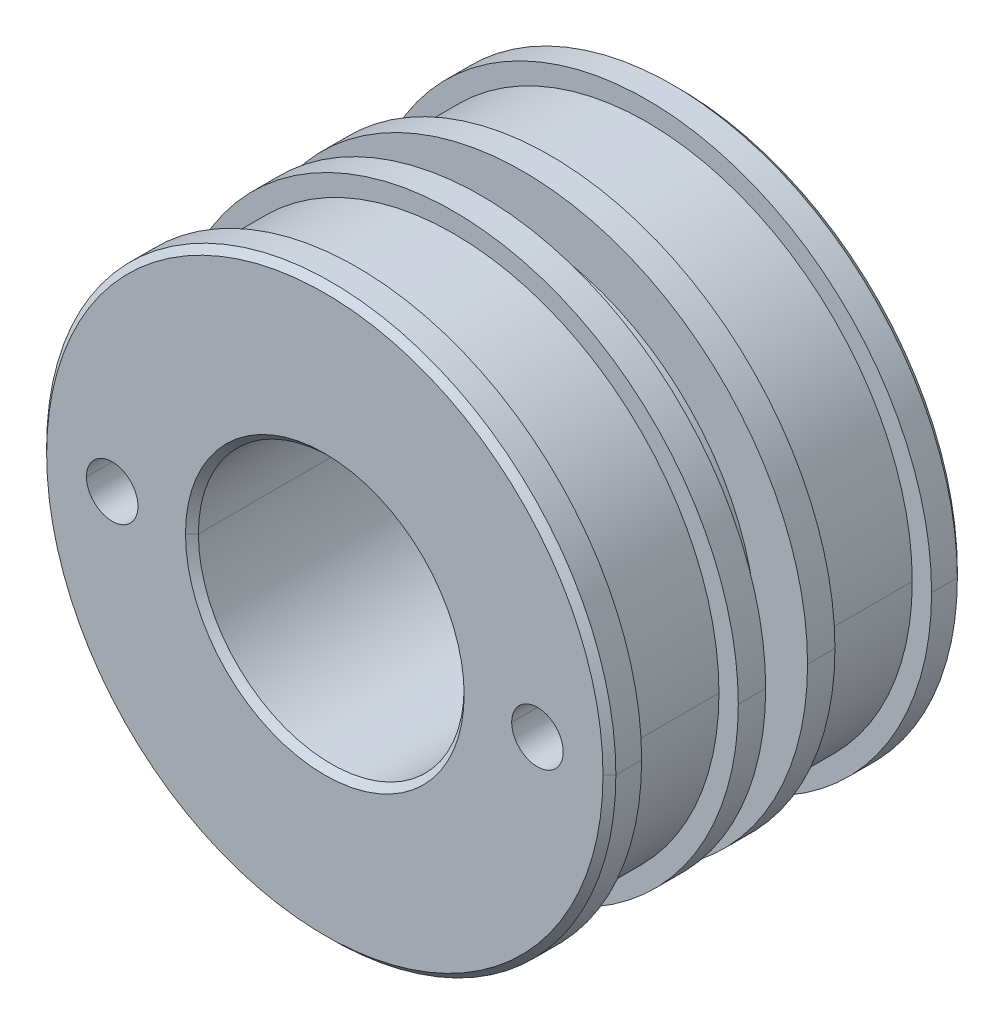
ISO-10303-21;
HEADER;
FILE_DESCRIPTION(('STEP AP214'),'2;1');
FILE_NAME('part.step','',(''),(''),'','','');
FILE_SCHEMA(('AUTOMOTIVE_DESIGN { 1 0 10303 214 1 1 1 1 }'));
ENDSEC;
DATA;
#1=APPLICATION_CONTEXT('core data for automotive mechanical design processes');
#2=APPLICATION_PROTOCOL_DEFINITION('international standard','automotive_design',2000,#1);
#3=PRODUCT_CONTEXT('',#1,'mechanical');
#4=PRODUCT('Part','Part','',(#3));
#5=PRODUCT_RELATED_PRODUCT_CATEGORY('part','',(#4));
#6=PRODUCT_DEFINITION_FORMATION('','',#4);
#7=PRODUCT_DEFINITION_CONTEXT('part definition',#1,'design');
#8=PRODUCT_DEFINITION('design','',#6,#7);
#9=PRODUCT_DEFINITION_SHAPE('','',#8);
#10=(LENGTH_UNIT() NAMED_UNIT(*) SI_UNIT(.MILLI.,.METRE.));
#11=(NAMED_UNIT(*) PLANE_ANGLE_UNIT() SI_UNIT($,.RADIAN.));
#12=(NAMED_UNIT(*) SI_UNIT($,.STERADIAN.) SOLID_ANGLE_UNIT());
#13=UNCERTAINTY_MEASURE_WITH_UNIT(LENGTH_MEASURE(1.E-05),#10,'distance_accuracy_value','');
#14=(GEOMETRIC_REPRESENTATION_CONTEXT(3) GLOBAL_UNCERTAINTY_ASSIGNED_CONTEXT((#13)) GLOBAL_UNIT_ASSIGNED_CONTEXT((#10,
#11,#12)) REPRESENTATION_CONTEXT('',''));
#15=CARTESIAN_POINT('',(0.,0.,0.));
#16=DIRECTION('',(0.,0.,1.));
#17=DIRECTION('',(1.,0.,0.));
#18=AXIS2_PLACEMENT_3D('',#15,#16,#17);
#19=CARTESIAN_POINT('',(-33.,0.,-9.));
#20=DIRECTION('',(0.,0.,1.));
#21=DIRECTION('',(1.,0.,0.));
#22=AXIS2_PLACEMENT_3D('',#19,#20,#21);
#23=PLANE('',#22);
#24=CARTESIAN_POINT('',(-33.,0.,-9.));
#25=DIRECTION('',(0.,0.,1.));
#26=DIRECTION('',(1.,0.,0.));
#27=AXIS2_PLACEMENT_3D('',#24,#25,#26);
#28=CIRCLE('',#27,4.);
#29=CARTESIAN_POINT('',(-29.,0.,-9.));
#30=VERTEX_POINT('',#29);
#31=CARTESIAN_POINT('',(-37.,0.,-9.));
#32=VERTEX_POINT('',#31);
#33=EDGE_CURVE('E10',#30,#32,#28,.T.);
#34=ORIENTED_EDGE('',*,*,#33,.T.);
#35=CARTESIAN_POINT('',(-33.,0.,-9.));
#36=DIRECTION('',(0.,0.,1.));
#37=DIRECTION('',(1.,0.,0.));
#38=AXIS2_PLACEMENT_3D('',#35,#36,#37);
#39=CIRCLE('',#38,4.);
#40=EDGE_CURVE('E388',#32,#30,#39,.T.);
#41=ORIENTED_EDGE('',*,*,#40,.T.);
#42=EDGE_LOOP('',(#34,#41));
#43=FACE_BOUND('',#42,.T.);
#44=ADVANCED_FACE('F15',(#43),#23,.T.);
#45=CARTESIAN_POINT('',(-33.,0.,-9.));
#46=DIRECTION('',(0.,0.,1.));
#47=DIRECTION('',(1.,0.,0.));
#48=AXIS2_PLACEMENT_3D('',#45,#46,#47);
#49=CYLINDRICAL_SURFACE('',#48,4.);
#50=DIRECTION('',(0.,0.,1.));
#51=VECTOR('',#50,1.);
#52=CARTESIAN_POINT('',(-37.,0.,-9.));
#53=LINE('',#52,#51);
#54=CARTESIAN_POINT('',(-37.,0.,0.));
#55=VERTEX_POINT('',#54);
#56=EDGE_CURVE('E384',#32,#55,#53,.T.);
#57=ORIENTED_EDGE('',*,*,#56,.F.);
#58=ORIENTED_EDGE('',*,*,#33,.F.);
#59=DIRECTION('',(0.,0.,1.));
#60=VECTOR('',#59,1.);
#61=CARTESIAN_POINT('',(-29.,0.,-9.));
#62=LINE('',#61,#60);
#63=CARTESIAN_POINT('',(-29.,0.,0.));
#64=VERTEX_POINT('',#63);
#65=EDGE_CURVE('E363',#30,#64,#62,.T.);
#66=ORIENTED_EDGE('',*,*,#65,.T.);
#67=CARTESIAN_POINT('',(-33.,0.,0.));
#68=DIRECTION('',(0.,0.,1.));
#69=DIRECTION('',(1.,0.,0.));
#70=AXIS2_PLACEMENT_3D('',#67,#68,#69);
#71=CIRCLE('',#70,4.);
#72=EDGE_CURVE('E334',#64,#55,#71,.T.);
#73=ORIENTED_EDGE('',*,*,#72,.T.);
#74=EDGE_LOOP('',(#57,#58,#66,#73));
#75=FACE_BOUND('',#74,.T.);
#76=ADVANCED_FACE('F575',(#75),#49,.F.);
#77=CARTESIAN_POINT('',(33.,0.,-9.));
#78=DIRECTION('',(0.,0.,1.));
#79=DIRECTION('',(1.,0.,0.));
#80=AXIS2_PLACEMENT_3D('',#77,#78,#79);
#81=PLANE('',#80);
#82=CARTESIAN_POINT('',(33.,0.,-9.));
#83=DIRECTION('',(0.,0.,1.));
#84=DIRECTION('',(1.,0.,0.));
#85=AXIS2_PLACEMENT_3D('',#82,#83,#84);
#86=CIRCLE('',#85,4.);
#87=CARTESIAN_POINT('',(37.,0.,-9.));
#88=VERTEX_POINT('',#87);
#89=CARTESIAN_POINT('',(29.,0.,-9.));
#90=VERTEX_POINT('',#89);
#91=EDGE_CURVE('E26',#88,#90,#86,.T.);
#92=ORIENTED_EDGE('',*,*,#91,.T.);
#93=CARTESIAN_POINT('',(33.,0.,-9.));
#94=DIRECTION('',(0.,0.,1.));
#95=DIRECTION('',(1.,0.,0.));
#96=AXIS2_PLACEMENT_3D('',#93,#94,#95);
#97=CIRCLE('',#96,4.);
#98=EDGE_CURVE('E367',#90,#88,#97,.T.);
#99=ORIENTED_EDGE('',*,*,#98,.T.);
#100=EDGE_LOOP('',(#92,#99));
#101=FACE_BOUND('',#100,.T.);
#102=ADVANCED_FACE('F581',(#101),#81,.T.);
#103=CARTESIAN_POINT('',(33.,0.,-9.));
#104=DIRECTION('',(0.,0.,1.));
#105=DIRECTION('',(1.,0.,0.));
#106=AXIS2_PLACEMENT_3D('',#103,#104,#105);
#107=CYLINDRICAL_SURFACE('',#106,4.);
#108=DIRECTION('',(0.,0.,1.));
#109=VECTOR('',#108,1.);
#110=CARTESIAN_POINT('',(29.,0.,-9.));
#111=LINE('',#110,#109);
#112=CARTESIAN_POINT('',(29.,0.,0.));
#113=VERTEX_POINT('',#112);
#114=EDGE_CURVE('E487',#90,#113,#111,.T.);
#115=ORIENTED_EDGE('',*,*,#114,.F.);
#116=ORIENTED_EDGE('',*,*,#91,.F.);
#117=DIRECTION('',(0.,0.,1.));
#118=VECTOR('',#117,1.);
#119=CARTESIAN_POINT('',(37.,0.,-9.));
#120=LINE('',#119,#118);
#121=CARTESIAN_POINT('',(37.,0.,0.));
#122=VERTEX_POINT('',#121);
#123=EDGE_CURVE('E279',#88,#122,#120,.T.);
#124=ORIENTED_EDGE('',*,*,#123,.T.);
#125=CARTESIAN_POINT('',(33.,0.,0.));
#126=DIRECTION('',(0.,0.,1.));
#127=DIRECTION('',(1.,0.,0.));
#128=AXIS2_PLACEMENT_3D('',#125,#126,#127);
#129=CIRCLE('',#128,4.);
#130=EDGE_CURVE('E331',#122,#113,#129,.T.);
#131=ORIENTED_EDGE('',*,*,#130,.T.);
#132=EDGE_LOOP('',(#115,#116,#124,#131));
#133=FACE_BOUND('',#132,.T.);
#134=ADVANCED_FACE('F604',(#133),#107,.F.);
#135=CARTESIAN_POINT('',(0.,0.,-54.));
#136=DIRECTION('',(0.,0.,-1.));
#137=DIRECTION('',(-1.,0.,0.));
#138=AXIS2_PLACEMENT_3D('',#135,#136,#137);
#139=CONICAL_SURFACE('',#138,24.5,0.785398163397452);
#140=DIRECTION('',(0.70710678118655,0.,-0.707106781186545));
#141=VECTOR('',#140,1.);
#142=CARTESIAN_POINT('',(24.5,0.,-54.));
#143=LINE('',#142,#141);
#144=CARTESIAN_POINT('',(24.5,0.,-54.));
#145=VERTEX_POINT('',#144);
#146=CARTESIAN_POINT('',(25.5,0.,-55.));
#147=VERTEX_POINT('',#146);
#148=EDGE_CURVE('E355',#145,#147,#143,.T.);
#149=ORIENTED_EDGE('',*,*,#148,.F.);
#150=CARTESIAN_POINT('',(0.,0.,-54.));
#151=DIRECTION('',(0.,0.,-1.));
#152=DIRECTION('',(1.,0.,0.));
#153=AXIS2_PLACEMENT_3D('',#150,#151,#152);
#154=CIRCLE('',#153,24.5);
#155=CARTESIAN_POINT('',(-24.5,0.,-54.));
#156=VERTEX_POINT('',#155);
#157=EDGE_CURVE('E278',#156,#145,#154,.T.);
#158=ORIENTED_EDGE('',*,*,#157,.F.);
#159=DIRECTION('',(-0.70710678118655,0.,-0.707106781186545));
#160=VECTOR('',#159,1.);
#161=CARTESIAN_POINT('',(-24.5,0.,-54.));
#162=LINE('',#161,#160);
#163=CARTESIAN_POINT('',(-25.5,0.,-55.));
#164=VERTEX_POINT('',#163);
#165=EDGE_CURVE('E372',#156,#164,#162,.T.);
#166=ORIENTED_EDGE('',*,*,#165,.T.);
#167=CARTESIAN_POINT('',(0.,0.,-55.));
#168=DIRECTION('',(0.,0.,1.));
#169=DIRECTION('',(1.,0.,0.));
#170=AXIS2_PLACEMENT_3D('',#167,#168,#169);
#171=CIRCLE('',#170,25.5);
#172=EDGE_CURVE('E321',#147,#164,#171,.T.);
#173=ORIENTED_EDGE('',*,*,#172,.F.);
#174=EDGE_LOOP('',(#149,#158,#166,#173));
#175=FACE_BOUND('',#174,.T.);
#176=ADVANCED_FACE('F822',(#175),#139,.F.);
#177=CARTESIAN_POINT('',(0.,0.,-40.));
#178=DIRECTION('',(0.,0.,-1.));
#179=DIRECTION('',(-1.,0.,0.));
#180=AXIS2_PLACEMENT_3D('',#177,#178,#179);
#181=CYLINDRICAL_SURFACE('',#180,24.5);
#182=DIRECTION('',(0.,0.,-1.));
#183=VECTOR('',#182,1.);
#184=CARTESIAN_POINT('',(24.5,0.,-40.));
#185=LINE('',#184,#183);
#186=CARTESIAN_POINT('',(24.5,0.,-40.));
#187=VERTEX_POINT('',#186);
#188=EDGE_CURVE('E396',#187,#145,#185,.T.);
#189=ORIENTED_EDGE('',*,*,#188,.F.);
#190=CARTESIAN_POINT('',(0.,0.,-40.));
#191=DIRECTION('',(0.,0.,-1.));
#192=DIRECTION('',(-1.,0.,0.));
#193=AXIS2_PLACEMENT_3D('',#190,#191,#192);
#194=CIRCLE('',#193,24.5);
#195=CARTESIAN_POINT('',(-24.5,0.,-40.));
#196=VERTEX_POINT('',#195);
#197=EDGE_CURVE('E275',#196,#187,#194,.T.);
#198=ORIENTED_EDGE('',*,*,#197,.F.);
#199=DIRECTION('',(0.,0.,-1.));
#200=VECTOR('',#199,1.);
#201=CARTESIAN_POINT('',(-24.5,0.,-40.));
#202=LINE('',#201,#200);
#203=EDGE_CURVE('E354',#196,#156,#202,.T.);
#204=ORIENTED_EDGE('',*,*,#203,.T.);
#205=ORIENTED_EDGE('',*,*,#157,.T.);
#206=EDGE_LOOP('',(#189,#198,#204,#205));
#207=FACE_BOUND('',#206,.T.);
#208=ADVANCED_FACE('F827',(#207),#181,.F.);
#209=CARTESIAN_POINT('',(0.,0.,-40.));
#210=DIRECTION('',(0.,0.,-1.));
#211=DIRECTION('',(0.,-1.,0.));
#212=AXIS2_PLACEMENT_3D('',#209,#210,#211);
#213=PLANE('',#212);
#214=CARTESIAN_POINT('',(0.,0.,-40.));
#215=DIRECTION('',(0.,0.,1.));
#216=DIRECTION('',(-1.,0.,0.));
#217=AXIS2_PLACEMENT_3D('',#214,#215,#216);
#218=CIRCLE('',#217,20.625);
#219=CARTESIAN_POINT('',(20.625,0.,-40.));
#220=VERTEX_POINT('',#219);
#221=CARTESIAN_POINT('',(-20.625,0.,-40.));
#222=VERTEX_POINT('',#221);
#223=EDGE_CURVE('E41',#220,#222,#218,.T.);
#224=ORIENTED_EDGE('',*,*,#223,.T.);
#225=CARTESIAN_POINT('',(0.,0.,-40.));
#226=DIRECTION('',(0.,0.,1.));
#227=DIRECTION('',(-1.,0.,0.));
#228=AXIS2_PLACEMENT_3D('',#225,#226,#227);
#229=CIRCLE('',#228,20.625);
#230=EDGE_CURVE('E320',#222,#220,#229,.T.);
#231=ORIENTED_EDGE('',*,*,#230,.T.);
#232=EDGE_LOOP('',(#224,#231));
#233=FACE_BOUND('',#232,.T.);
#234=ORIENTED_EDGE('',*,*,#197,.T.);
#235=CARTESIAN_POINT('',(0.,0.,-40.));
#236=DIRECTION('',(0.,0.,-1.));
#237=DIRECTION('',(-1.,0.,0.));
#238=AXIS2_PLACEMENT_3D('',#235,#236,#237);
#239=CIRCLE('',#238,24.5);
#240=EDGE_CURVE('E376',#187,#196,#239,.T.);
#241=ORIENTED_EDGE('',*,*,#240,.T.);
#242=EDGE_LOOP('',(#234,#241));
#243=FACE_BOUND('',#242,.T.);
#244=ADVANCED_FACE('F624',(#233,#243),#213,.T.);
#245=CARTESIAN_POINT('',(0.,0.,0.));
#246=DIRECTION('',(0.,0.,-1.));
#247=DIRECTION('',(-1.,0.,0.));
#248=AXIS2_PLACEMENT_3D('',#245,#246,#247);
#249=CONICAL_SURFACE('',#248,43.175,0.785398163397435);
#250=DIRECTION('',(0.707106781186538,0.,-0.707106781186558));
#251=VECTOR('',#250,1.);
#252=CARTESIAN_POINT('',(43.175,0.,0.));
#253=LINE('',#252,#251);
#254=CARTESIAN_POINT('',(43.175,0.,0.));
#255=VERTEX_POINT('',#254);
#256=CARTESIAN_POINT('',(44.175,0.,-1.00000000000004));
#257=VERTEX_POINT('',#256);
#258=EDGE_CURVE('E353',#255,#257,#253,.T.);
#259=ORIENTED_EDGE('',*,*,#258,.F.);
#260=CARTESIAN_POINT('',(0.,0.,0.));
#261=DIRECTION('',(0.,0.,1.));
#262=DIRECTION('',(1.,0.,0.));
#263=AXIS2_PLACEMENT_3D('',#260,#261,#262);
#264=CIRCLE('',#263,43.175);
#265=CARTESIAN_POINT('',(-43.175,0.,0.));
#266=VERTEX_POINT('',#265);
#267=EDGE_CURVE('E325',#266,#255,#264,.T.);
#268=ORIENTED_EDGE('',*,*,#267,.F.);
#269=DIRECTION('',(-0.707106781186538,0.,-0.707106781186558));
#270=VECTOR('',#269,1.);
#271=CARTESIAN_POINT('',(-43.175,0.,0.));
#272=LINE('',#271,#270);
#273=CARTESIAN_POINT('',(-44.175,0.,-1.00000000000004));
#274=VERTEX_POINT('',#273);
#275=EDGE_CURVE('E314',#266,#274,#272,.T.);
#276=ORIENTED_EDGE('',*,*,#275,.T.);
#277=CARTESIAN_POINT('',(0.,0.,-1.00000000000004));
#278=DIRECTION('',(0.,0.,-1.));
#279=DIRECTION('',(1.,0.,0.));
#280=AXIS2_PLACEMENT_3D('',#277,#278,#279);
#281=CIRCLE('',#280,44.175);
#282=EDGE_CURVE('E441',#257,#274,#281,.T.);
#283=ORIENTED_EDGE('',*,*,#282,.F.);
#284=EDGE_LOOP('',(#259,#268,#276,#283));
#285=FACE_BOUND('',#284,.T.);
#286=ADVANCED_FACE('F621',(#285),#249,.T.);
#287=CARTESIAN_POINT('',(0.,0.,-1.00000000000002));
#288=DIRECTION('',(0.,0.,1.));
#289=DIRECTION('',(1.,0.,0.));
#290=AXIS2_PLACEMENT_3D('',#287,#288,#289);
#291=CONICAL_SURFACE('',#290,20.625,0.785398163397453);
#292=DIRECTION('',(-0.707106781186551,0.,0.707106781186544));
#293=VECTOR('',#292,1.);
#294=CARTESIAN_POINT('',(-20.625,0.,-1.00000000000002));
#295=LINE('',#294,#293);
#296=CARTESIAN_POINT('',(-20.625,0.,-1.00000000000002));
#297=VERTEX_POINT('',#296);
#298=CARTESIAN_POINT('',(-21.625,0.,0.));
#299=VERTEX_POINT('',#298);
#300=EDGE_CURVE('E313',#297,#299,#295,.T.);
#301=ORIENTED_EDGE('',*,*,#300,.F.);
#302=CARTESIAN_POINT('',(0.,0.,-1.00000000000002));
#303=DIRECTION('',(0.,0.,1.));
#304=DIRECTION('',(1.,0.,0.));
#305=AXIS2_PLACEMENT_3D('',#302,#303,#304);
#306=CIRCLE('',#305,20.625);
#307=CARTESIAN_POINT('',(20.625,0.,-1.00000000000002));
#308=VERTEX_POINT('',#307);
#309=EDGE_CURVE('E175',#308,#297,#306,.T.);
#310=ORIENTED_EDGE('',*,*,#309,.F.);
#311=DIRECTION('',(0.707106781186551,0.,0.707106781186544));
#312=VECTOR('',#311,1.);
#313=CARTESIAN_POINT('',(20.625,0.,-1.00000000000002));
#314=LINE('',#313,#312);
#315=CARTESIAN_POINT('',(21.625,0.,0.));
#316=VERTEX_POINT('',#315);
#317=EDGE_CURVE('E435',#308,#316,#314,.T.);
#318=ORIENTED_EDGE('',*,*,#317,.T.);
#319=CARTESIAN_POINT('',(0.,0.,0.));
#320=DIRECTION('',(0.,0.,-1.));
#321=DIRECTION('',(1.,0.,0.));
#322=AXIS2_PLACEMENT_3D('',#319,#320,#321);
#323=CIRCLE('',#322,21.625);
#324=EDGE_CURVE('E184',#299,#316,#323,.T.);
#325=ORIENTED_EDGE('',*,*,#324,.F.);
#326=EDGE_LOOP('',(#301,#310,#318,#325));
#327=FACE_BOUND('',#326,.T.);
#328=ADVANCED_FACE('F600',(#327),#291,.F.);
#329=CARTESIAN_POINT('',(0.,0.,-54.));
#330=DIRECTION('',(0.,0.,1.));
#331=DIRECTION('',(1.,0.,0.));
#332=AXIS2_PLACEMENT_3D('',#329,#330,#331);
#333=CONICAL_SURFACE('',#332,44.175,0.785398163397459);
#334=DIRECTION('',(-0.707106781186555,0.,0.70710678118654));
#335=VECTOR('',#334,1.);
#336=CARTESIAN_POINT('',(-44.175,0.,-54.));
#337=LINE('',#336,#335);
#338=CARTESIAN_POINT('',(-43.175,0.,-55.));
#339=VERTEX_POINT('',#338);
#340=CARTESIAN_POINT('',(-44.175,0.,-54.));
#341=VERTEX_POINT('',#340);
#342=EDGE_CURVE('E434',#339,#341,#337,.T.);
#343=ORIENTED_EDGE('',*,*,#342,.F.);
#344=CARTESIAN_POINT('',(0.,0.,-55.));
#345=DIRECTION('',(0.,0.,-1.));
#346=DIRECTION('',(1.,0.,0.));
#347=AXIS2_PLACEMENT_3D('',#344,#345,#346);
#348=CIRCLE('',#347,43.175);
#349=CARTESIAN_POINT('',(43.175,0.,-55.));
#350=VERTEX_POINT('',#349);
#351=EDGE_CURVE('E326',#350,#339,#348,.T.);
#352=ORIENTED_EDGE('',*,*,#351,.F.);
#353=DIRECTION('',(0.707106781186555,0.,0.70710678118654));
#354=VECTOR('',#353,1.);
#355=CARTESIAN_POINT('',(44.175,0.,-54.));
#356=LINE('',#355,#354);
#357=CARTESIAN_POINT('',(44.175,0.,-54.));
#358=VERTEX_POINT('',#357);
#359=EDGE_CURVE('E285',#350,#358,#356,.T.);
#360=ORIENTED_EDGE('',*,*,#359,.T.);
#361=CARTESIAN_POINT('',(0.,0.,-54.));
#362=DIRECTION('',(0.,0.,1.));
#363=DIRECTION('',(1.,0.,0.));
#364=AXIS2_PLACEMENT_3D('',#361,#362,#363);
#365=CIRCLE('',#364,44.175);
#366=EDGE_CURVE('E392',#341,#358,#365,.T.);
#367=ORIENTED_EDGE('',*,*,#366,.F.);
#368=EDGE_LOOP('',(#343,#352,#360,#367));
#369=FACE_BOUND('',#368,.T.);
#370=ADVANCED_FACE('F596',(#369),#333,.T.);
#371=CARTESIAN_POINT('',(0.,44.175,-20.));
#372=DIRECTION('',(0.,0.,1.));
#373=DIRECTION('',(1.,0.,0.));
#374=AXIS2_PLACEMENT_3D('',#371,#372,#373);
#375=PLANE('',#374);
#376=CARTESIAN_POINT('',(0.,0.,-20.));
#377=DIRECTION('',(0.,0.,1.));
#378=DIRECTION('',(1.,0.,0.));
#379=AXIS2_PLACEMENT_3D('',#376,#377,#378);
#380=CIRCLE('',#379,41.175);
#381=CARTESIAN_POINT('',(41.175,0.,-20.));
#382=VERTEX_POINT('',#381);
#383=CARTESIAN_POINT('',(-41.175,0.,-20.));
#384=VERTEX_POINT('',#383);
#385=EDGE_CURVE('E289',#382,#384,#380,.T.);
#386=ORIENTED_EDGE('',*,*,#385,.F.);
#387=CARTESIAN_POINT('',(0.,0.,-20.));
#388=DIRECTION('',(0.,0.,1.));
#389=DIRECTION('',(1.,0.,0.));
#390=AXIS2_PLACEMENT_3D('',#387,#388,#389);
#391=CIRCLE('',#390,41.175);
#392=EDGE_CURVE('E274',#384,#382,#391,.T.);
#393=ORIENTED_EDGE('',*,*,#392,.F.);
#394=EDGE_LOOP('',(#386,#393));
#395=FACE_BOUND('',#394,.T.);
#396=CARTESIAN_POINT('',(0.,0.,-20.));
#397=DIRECTION('',(0.,0.,1.));
#398=DIRECTION('',(1.,0.,0.));
#399=AXIS2_PLACEMENT_3D('',#396,#397,#398);
#400=CIRCLE('',#399,44.175);
#401=CARTESIAN_POINT('',(44.175,0.,-20.));
#402=VERTEX_POINT('',#401);
#403=CARTESIAN_POINT('',(-44.175,0.,-20.));
#404=VERTEX_POINT('',#403);
#405=EDGE_CURVE('E461',#402,#404,#400,.T.);
#406=ORIENTED_EDGE('',*,*,#405,.T.);
#407=CARTESIAN_POINT('',(0.,0.,-20.));
#408=DIRECTION('',(0.,0.,1.));
#409=DIRECTION('',(1.,0.,0.));
#410=AXIS2_PLACEMENT_3D('',#407,#408,#409);
#411=CIRCLE('',#410,44.175);
#412=EDGE_CURVE('E260',#404,#402,#411,.T.);
#413=ORIENTED_EDGE('',*,*,#412,.T.);
#414=EDGE_LOOP('',(#406,#413));
#415=FACE_BOUND('',#414,.T.);
#416=ADVANCED_FACE('F599',(#395,#415),#375,.T.);
#417=CARTESIAN_POINT('',(0.,0.,0.));
#418=DIRECTION('',(0.,0.,1.));
#419=DIRECTION('',(1.,0.,0.));
#420=AXIS2_PLACEMENT_3D('',#417,#418,#419);
#421=CYLINDRICAL_SURFACE('',#420,41.175);
#422=DIRECTION('',(0.,0.,1.));
#423=VECTOR('',#422,1.);
#424=CARTESIAN_POINT('',(-41.175,0.,0.));
#425=LINE('',#424,#423);
#426=CARTESIAN_POINT('',(-41.175,0.,-5.));
#427=VERTEX_POINT('',#426);
#428=EDGE_CURVE('E330',#384,#427,#425,.T.);
#429=ORIENTED_EDGE('',*,*,#428,.F.);
#430=ORIENTED_EDGE('',*,*,#392,.T.);
#431=DIRECTION('',(0.,0.,1.));
#432=VECTOR('',#431,1.);
#433=CARTESIAN_POINT('',(41.175,0.,0.));
#434=LINE('',#433,#432);
#435=CARTESIAN_POINT('',(41.175,0.,-5.));
#436=VERTEX_POINT('',#435);
#437=EDGE_CURVE('E291',#382,#436,#434,.T.);
#438=ORIENTED_EDGE('',*,*,#437,.T.);
#439=CARTESIAN_POINT('',(0.,0.,-5.));
#440=DIRECTION('',(0.,0.,1.));
#441=DIRECTION('',(1.,0.,0.));
#442=AXIS2_PLACEMENT_3D('',#439,#440,#441);
#443=CIRCLE('',#442,41.175);
#444=EDGE_CURVE('E263',#427,#436,#443,.T.);
#445=ORIENTED_EDGE('',*,*,#444,.F.);
#446=EDGE_LOOP('',(#429,#430,#438,#445));
#447=FACE_BOUND('',#446,.T.);
#448=ADVANCED_FACE('F586',(#447),#421,.T.);
#449=CARTESIAN_POINT('',(0.,44.175,-5.));
#450=DIRECTION('',(0.,0.,-1.));
#451=DIRECTION('',(0.,-1.,0.));
#452=AXIS2_PLACEMENT_3D('',#449,#450,#451);
#453=PLANE('',#452);
#454=CARTESIAN_POINT('',(0.,0.,-5.));
#455=DIRECTION('',(0.,0.,1.));
#456=DIRECTION('',(1.,0.,0.));
#457=AXIS2_PLACEMENT_3D('',#454,#455,#456);
#458=CIRCLE('',#457,41.175);
#459=EDGE_CURVE('E296',#436,#427,#458,.T.);
#460=ORIENTED_EDGE('',*,*,#459,.T.);
#461=ORIENTED_EDGE('',*,*,#444,.T.);
#462=EDGE_LOOP('',(#460,#461));
#463=FACE_BOUND('',#462,.T.);
#464=CARTESIAN_POINT('',(0.,0.,-5.));
#465=DIRECTION('',(0.,0.,1.));
#466=DIRECTION('',(1.,0.,0.));
#467=AXIS2_PLACEMENT_3D('',#464,#465,#466);
#468=CIRCLE('',#467,44.175);
#469=CARTESIAN_POINT('',(44.175,0.,-5.));
#470=VERTEX_POINT('',#469);
#471=CARTESIAN_POINT('',(-44.175,0.,-5.));
#472=VERTEX_POINT('',#471);
#473=EDGE_CURVE('E344',#470,#472,#468,.T.);
#474=ORIENTED_EDGE('',*,*,#473,.F.);
#475=CARTESIAN_POINT('',(0.,0.,-5.));
#476=DIRECTION('',(0.,0.,1.));
#477=DIRECTION('',(1.,0.,0.));
#478=AXIS2_PLACEMENT_3D('',#475,#476,#477);
#479=CIRCLE('',#478,44.175);
#480=EDGE_CURVE('E383',#472,#470,#479,.T.);
#481=ORIENTED_EDGE('',*,*,#480,.F.);
#482=EDGE_LOOP('',(#474,#481));
#483=FACE_BOUND('',#482,.T.);
#484=ADVANCED_FACE('F595',(#463,#483),#453,.T.);
#485=CARTESIAN_POINT('',(0.,0.,-55.));
#486=DIRECTION('',(0.,0.,1.));
#487=DIRECTION('',(1.,0.,0.));
#488=AXIS2_PLACEMENT_3D('',#485,#486,#487);
#489=CYLINDRICAL_SURFACE('',#488,44.175);
#490=DIRECTION('',(0.,0.,1.));
#491=VECTOR('',#490,1.);
#492=CARTESIAN_POINT('',(-44.175,0.,-55.));
#493=LINE('',#492,#491);
#494=CARTESIAN_POINT('',(-44.175,0.,-24.25));
#495=VERTEX_POINT('',#494);
#496=EDGE_CURVE('E19',#495,#404,#493,.T.);
#497=ORIENTED_EDGE('',*,*,#496,.F.);
#498=CARTESIAN_POINT('',(0.,0.,-24.25));
#499=DIRECTION('',(0.,0.,1.));
#500=DIRECTION('',(1.,0.,0.));
#501=AXIS2_PLACEMENT_3D('',#498,#499,#500);
#502=CIRCLE('',#501,44.175);
#503=CARTESIAN_POINT('',(44.175,0.,-24.25));
#504=VERTEX_POINT('',#503);
#505=EDGE_CURVE('E409',#495,#504,#502,.T.);
#506=ORIENTED_EDGE('',*,*,#505,.T.);
#507=DIRECTION('',(0.,0.,1.));
#508=VECTOR('',#507,1.);
#509=CARTESIAN_POINT('',(44.175,0.,-55.));
#510=LINE('',#509,#508);
#511=EDGE_CURVE('E308',#504,#402,#510,.T.);
#512=ORIENTED_EDGE('',*,*,#511,.T.);
#513=ORIENTED_EDGE('',*,*,#412,.F.);
#514=EDGE_LOOP('',(#497,#506,#512,#513));
#515=FACE_BOUND('',#514,.T.);
#516=ADVANCED_FACE('F547',(#515),#489,.T.);
#517=CARTESIAN_POINT('',(0.,44.175,-30.75));
#518=DIRECTION('',(0.,0.,1.));
#519=DIRECTION('',(1.,0.,0.));
#520=AXIS2_PLACEMENT_3D('',#517,#518,#519);
#521=PLANE('',#520);
#522=CARTESIAN_POINT('',(0.,0.,-30.75));
#523=DIRECTION('',(0.,0.,1.));
#524=DIRECTION('',(1.,0.,0.));
#525=AXIS2_PLACEMENT_3D('',#522,#523,#524);
#526=CIRCLE('',#525,36.175);
#527=CARTESIAN_POINT('',(36.175,0.,-30.75));
#528=VERTEX_POINT('',#527);
#529=CARTESIAN_POINT('',(-36.175,0.,-30.75));
#530=VERTEX_POINT('',#529);
#531=EDGE_CURVE('E303',#528,#530,#526,.T.);
#532=ORIENTED_EDGE('',*,*,#531,.F.);
#533=CARTESIAN_POINT('',(0.,0.,-30.75));
#534=DIRECTION('',(0.,0.,1.));
#535=DIRECTION('',(1.,0.,0.));
#536=AXIS2_PLACEMENT_3D('',#533,#534,#535);
#537=CIRCLE('',#536,36.175);
#538=EDGE_CURVE('E264',#530,#528,#537,.T.);
#539=ORIENTED_EDGE('',*,*,#538,.F.);
#540=EDGE_LOOP('',(#532,#539));
#541=FACE_BOUND('',#540,.T.);
#542=CARTESIAN_POINT('',(0.,0.,-30.75));
#543=DIRECTION('',(0.,0.,1.));
#544=DIRECTION('',(1.,0.,0.));
#545=AXIS2_PLACEMENT_3D('',#542,#543,#544);
#546=CIRCLE('',#545,44.175);
#547=CARTESIAN_POINT('',(44.175,0.,-30.75));
#548=VERTEX_POINT('',#547);
#549=CARTESIAN_POINT('',(-44.175,0.,-30.75));
#550=VERTEX_POINT('',#549);
#551=EDGE_CURVE('E410',#548,#550,#546,.T.);
#552=ORIENTED_EDGE('',*,*,#551,.T.);
#553=CARTESIAN_POINT('',(0.,0.,-30.75));
#554=DIRECTION('',(0.,0.,1.));
#555=DIRECTION('',(1.,0.,0.));
#556=AXIS2_PLACEMENT_3D('',#553,#554,#555);
#557=CIRCLE('',#556,44.175);
#558=EDGE_CURVE('E259',#550,#548,#557,.T.);
#559=ORIENTED_EDGE('',*,*,#558,.T.);
#560=EDGE_LOOP('',(#552,#559));
#561=FACE_BOUND('',#560,.T.);
#562=ADVANCED_FACE('F568',(#541,#561),#521,.T.);
#563=CARTESIAN_POINT('',(0.,0.,0.));
#564=DIRECTION('',(0.,0.,1.));
#565=DIRECTION('',(1.,0.,0.));
#566=AXIS2_PLACEMENT_3D('',#563,#564,#565);
#567=CYLINDRICAL_SURFACE('',#566,36.175);
#568=DIRECTION('',(0.,0.,1.));
#569=VECTOR('',#568,1.);
#570=CARTESIAN_POINT('',(-36.175,0.,0.));
#571=LINE('',#570,#569);
#572=CARTESIAN_POINT('',(-36.175,0.,-24.25));
#573=VERTEX_POINT('',#572);
#574=EDGE_CURVE('E307',#530,#573,#571,.T.);
#575=ORIENTED_EDGE('',*,*,#574,.F.);
#576=ORIENTED_EDGE('',*,*,#538,.T.);
#577=DIRECTION('',(0.,0.,1.));
#578=VECTOR('',#577,1.);
#579=CARTESIAN_POINT('',(36.175,0.,0.));
#580=LINE('',#579,#578);
#581=CARTESIAN_POINT('',(36.175,0.,-24.25));
#582=VERTEX_POINT('',#581);
#583=EDGE_CURVE('E302',#528,#582,#580,.T.);
#584=ORIENTED_EDGE('',*,*,#583,.T.);
#585=CARTESIAN_POINT('',(0.,0.,-24.25));
#586=DIRECTION('',(0.,0.,1.));
#587=DIRECTION('',(1.,0.,0.));
#588=AXIS2_PLACEMENT_3D('',#585,#586,#587);
#589=CIRCLE('',#588,36.175);
#590=EDGE_CURVE('E362',#573,#582,#589,.T.);
#591=ORIENTED_EDGE('',*,*,#590,.F.);
#592=EDGE_LOOP('',(#575,#576,#584,#591));
#593=FACE_BOUND('',#592,.T.);
#594=ADVANCED_FACE('F557',(#593),#567,.T.);
#595=CARTESIAN_POINT('',(0.,44.175,-24.25));
#596=DIRECTION('',(0.,0.,-1.));
#597=DIRECTION('',(0.,-1.,0.));
#598=AXIS2_PLACEMENT_3D('',#595,#596,#597);
#599=PLANE('',#598);
#600=CARTESIAN_POINT('',(0.,0.,-24.25));
#601=DIRECTION('',(0.,0.,1.));
#602=DIRECTION('',(1.,0.,0.));
#603=AXIS2_PLACEMENT_3D('',#600,#601,#602);
#604=CIRCLE('',#603,36.175);
#605=EDGE_CURVE('E255',#582,#573,#604,.T.);
#606=ORIENTED_EDGE('',*,*,#605,.T.);
#607=ORIENTED_EDGE('',*,*,#590,.T.);
#608=EDGE_LOOP('',(#606,#607));
#609=FACE_BOUND('',#608,.T.);
#610=CARTESIAN_POINT('',(0.,0.,-24.25));
#611=DIRECTION('',(0.,0.,1.));
#612=DIRECTION('',(1.,0.,0.));
#613=AXIS2_PLACEMENT_3D('',#610,#611,#612);
#614=CIRCLE('',#613,44.175);
#615=EDGE_CURVE('E295',#504,#495,#614,.T.);
#616=ORIENTED_EDGE('',*,*,#615,.F.);
#617=ORIENTED_EDGE('',*,*,#505,.F.);
#618=EDGE_LOOP('',(#616,#617));
#619=FACE_BOUND('',#618,.T.);
#620=ADVANCED_FACE('F554',(#609,#619),#599,.T.);
#621=CARTESIAN_POINT('',(0.,0.,-55.));
#622=DIRECTION('',(0.,0.,1.));
#623=DIRECTION('',(1.,0.,0.));
#624=AXIS2_PLACEMENT_3D('',#621,#622,#623);
#625=CYLINDRICAL_SURFACE('',#624,44.175);
#626=DIRECTION('',(0.,0.,1.));
#627=VECTOR('',#626,1.);
#628=CARTESIAN_POINT('',(-44.175,0.,-55.));
#629=LINE('',#628,#627);
#630=CARTESIAN_POINT('',(-44.175,0.,-35.));
#631=VERTEX_POINT('',#630);
#632=EDGE_CURVE('E301',#631,#550,#629,.T.);
#633=ORIENTED_EDGE('',*,*,#632,.F.);
#634=CARTESIAN_POINT('',(0.,0.,-35.));
#635=DIRECTION('',(0.,0.,1.));
#636=DIRECTION('',(1.,0.,0.));
#637=AXIS2_PLACEMENT_3D('',#634,#635,#636);
#638=CIRCLE('',#637,44.175);
#639=CARTESIAN_POINT('',(44.175,0.,-35.));
#640=VERTEX_POINT('',#639);
#641=EDGE_CURVE('E232',#631,#640,#638,.T.);
#642=ORIENTED_EDGE('',*,*,#641,.T.);
#643=DIRECTION('',(0.,0.,1.));
#644=VECTOR('',#643,1.);
#645=CARTESIAN_POINT('',(44.175,0.,-55.));
#646=LINE('',#645,#644);
#647=EDGE_CURVE('E271',#640,#548,#646,.T.);
#648=ORIENTED_EDGE('',*,*,#647,.T.);
#649=ORIENTED_EDGE('',*,*,#558,.F.);
#650=EDGE_LOOP('',(#633,#642,#648,#649));
#651=FACE_BOUND('',#650,.T.);
#652=ADVANCED_FACE('F556',(#651),#625,.T.);
#653=CARTESIAN_POINT('',(0.,44.175,-50.));
#654=DIRECTION('',(0.,0.,1.));
#655=DIRECTION('',(1.,0.,0.));
#656=AXIS2_PLACEMENT_3D('',#653,#654,#655);
#657=PLANE('',#656);
#658=CARTESIAN_POINT('',(0.,0.,-50.));
#659=DIRECTION('',(0.,0.,1.));
#660=DIRECTION('',(1.,0.,0.));
#661=AXIS2_PLACEMENT_3D('',#658,#659,#660);
#662=CIRCLE('',#661,41.175);
#663=CARTESIAN_POINT('',(41.175,0.,-50.));
#664=VERTEX_POINT('',#663);
#665=CARTESIAN_POINT('',(-41.175,0.,-50.));
#666=VERTEX_POINT('',#665);
#667=EDGE_CURVE('E251',#664,#666,#662,.T.);
#668=ORIENTED_EDGE('',*,*,#667,.F.);
#669=CARTESIAN_POINT('',(0.,0.,-50.));
#670=DIRECTION('',(0.,0.,1.));
#671=DIRECTION('',(1.,0.,0.));
#672=AXIS2_PLACEMENT_3D('',#669,#670,#671);
#673=CIRCLE('',#672,41.175);
#674=EDGE_CURVE('E231',#666,#664,#673,.T.);
#675=ORIENTED_EDGE('',*,*,#674,.F.);
#676=EDGE_LOOP('',(#668,#675));
#677=FACE_BOUND('',#676,.T.);
#678=CARTESIAN_POINT('',(0.,0.,-50.));
#679=DIRECTION('',(0.,0.,1.));
#680=DIRECTION('',(1.,0.,0.));
#681=AXIS2_PLACEMENT_3D('',#678,#679,#680);
#682=CIRCLE('',#681,44.175);
#683=CARTESIAN_POINT('',(44.175,0.,-50.));
#684=VERTEX_POINT('',#683);
#685=CARTESIAN_POINT('',(-44.175,0.,-50.));
#686=VERTEX_POINT('',#685);
#687=EDGE_CURVE('E268',#684,#686,#682,.T.);
#688=ORIENTED_EDGE('',*,*,#687,.T.);
#689=CARTESIAN_POINT('',(0.,0.,-50.));
#690=DIRECTION('',(0.,0.,1.));
#691=DIRECTION('',(1.,0.,0.));
#692=AXIS2_PLACEMENT_3D('',#689,#690,#691);
#693=CIRCLE('',#692,44.175);
#694=EDGE_CURVE('E389',#686,#684,#693,.T.);
#695=ORIENTED_EDGE('',*,*,#694,.T.);
#696=EDGE_LOOP('',(#688,#695));
#697=FACE_BOUND('',#696,.T.);
#698=ADVANCED_FACE('F565',(#677,#697),#657,.T.);
#699=CARTESIAN_POINT('',(0.,0.,0.));
#700=DIRECTION('',(0.,0.,1.));
#701=DIRECTION('',(1.,0.,0.));
#702=AXIS2_PLACEMENT_3D('',#699,#700,#701);
#703=CYLINDRICAL_SURFACE('',#702,41.175);
#704=DIRECTION('',(0.,0.,1.));
#705=VECTOR('',#704,1.);
#706=CARTESIAN_POINT('',(-41.175,0.,0.));
#707=LINE('',#706,#705);
#708=CARTESIAN_POINT('',(-41.175,0.,-35.));
#709=VERTEX_POINT('',#708);
#710=EDGE_CURVE('E244',#666,#709,#707,.T.);
#711=ORIENTED_EDGE('',*,*,#710,.F.);
#712=ORIENTED_EDGE('',*,*,#674,.T.);
#713=DIRECTION('',(0.,0.,1.));
#714=VECTOR('',#713,1.);
#715=CARTESIAN_POINT('',(41.175,0.,0.));
#716=LINE('',#715,#714);
#717=CARTESIAN_POINT('',(41.175,0.,-35.));
#718=VERTEX_POINT('',#717);
#719=EDGE_CURVE('E235',#664,#718,#716,.T.);
#720=ORIENTED_EDGE('',*,*,#719,.T.);
#721=CARTESIAN_POINT('',(0.,0.,-35.));
#722=DIRECTION('',(0.,0.,1.));
#723=DIRECTION('',(1.,0.,0.));
#724=AXIS2_PLACEMENT_3D('',#721,#722,#723);
#725=CIRCLE('',#724,41.175);
#726=EDGE_CURVE('E221',#709,#718,#725,.T.);
#727=ORIENTED_EDGE('',*,*,#726,.F.);
#728=EDGE_LOOP('',(#711,#712,#720,#727));
#729=FACE_BOUND('',#728,.T.);
#730=ADVANCED_FACE('F236',(#729),#703,.T.);
#731=CARTESIAN_POINT('',(0.,44.175,-35.));
#732=DIRECTION('',(0.,0.,-1.));
#733=DIRECTION('',(0.,-1.,0.));
#734=AXIS2_PLACEMENT_3D('',#731,#732,#733);
#735=PLANE('',#734);
#736=CARTESIAN_POINT('',(0.,0.,-35.));
#737=DIRECTION('',(0.,0.,1.));
#738=DIRECTION('',(1.,0.,0.));
#739=AXIS2_PLACEMENT_3D('',#736,#737,#738);
#740=CIRCLE('',#739,41.175);
#741=EDGE_CURVE('E226',#718,#709,#740,.T.);
#742=ORIENTED_EDGE('',*,*,#741,.T.);
#743=ORIENTED_EDGE('',*,*,#726,.T.);
#744=EDGE_LOOP('',(#742,#743));
#745=FACE_BOUND('',#744,.T.);
#746=CARTESIAN_POINT('',(0.,0.,-35.));
#747=DIRECTION('',(0.,0.,1.));
#748=DIRECTION('',(1.,0.,0.));
#749=AXIS2_PLACEMENT_3D('',#746,#747,#748);
#750=CIRCLE('',#749,44.175);
#751=EDGE_CURVE('E297',#640,#631,#750,.T.);
#752=ORIENTED_EDGE('',*,*,#751,.F.);
#753=ORIENTED_EDGE('',*,*,#641,.F.);
#754=EDGE_LOOP('',(#752,#753));
#755=FACE_BOUND('',#754,.T.);
#756=ADVANCED_FACE('F223',(#745,#755),#735,.T.);
#757=CARTESIAN_POINT('',(0.,0.,0.));
#758=DIRECTION('',(0.,0.,1.));
#759=DIRECTION('',(1.,0.,0.));
#760=AXIS2_PLACEMENT_3D('',#757,#758,#759);
#761=PLANE('',#760);
#762=CARTESIAN_POINT('',(0.,0.,0.));
#763=DIRECTION('',(0.,0.,-1.));
#764=DIRECTION('',(1.,0.,0.));
#765=AXIS2_PLACEMENT_3D('',#762,#763,#764);
#766=CIRCLE('',#765,21.625);
#767=EDGE_CURVE('E348',#316,#299,#766,.T.);
#768=ORIENTED_EDGE('',*,*,#767,.T.);
#769=ORIENTED_EDGE('',*,*,#324,.T.);
#770=EDGE_LOOP('',(#768,#769));
#771=FACE_BOUND('',#770,.T.);
#772=ORIENTED_EDGE('',*,*,#130,.F.);
#773=CARTESIAN_POINT('',(33.,0.,0.));
#774=DIRECTION('',(0.,0.,1.));
#775=DIRECTION('',(1.,0.,0.));
#776=AXIS2_PLACEMENT_3D('',#773,#774,#775);
#777=CIRCLE('',#776,4.);
#778=EDGE_CURVE('E284',#113,#122,#777,.T.);
#779=ORIENTED_EDGE('',*,*,#778,.F.);
#780=EDGE_LOOP('',(#772,#779));
#781=FACE_BOUND('',#780,.T.);
#782=ORIENTED_EDGE('',*,*,#72,.F.);
#783=CARTESIAN_POINT('',(-33.,0.,0.));
#784=DIRECTION('',(0.,0.,1.));
#785=DIRECTION('',(1.,0.,0.));
#786=AXIS2_PLACEMENT_3D('',#783,#784,#785);
#787=CIRCLE('',#786,4.);
#788=EDGE_CURVE('E368',#55,#64,#787,.T.);
#789=ORIENTED_EDGE('',*,*,#788,.F.);
#790=EDGE_LOOP('',(#782,#789));
#791=FACE_BOUND('',#790,.T.);
#792=ORIENTED_EDGE('',*,*,#267,.T.);
#793=CARTESIAN_POINT('',(0.,0.,0.));
#794=DIRECTION('',(0.,0.,1.));
#795=DIRECTION('',(1.,0.,0.));
#796=AXIS2_PLACEMENT_3D('',#793,#794,#795);
#797=CIRCLE('',#796,43.175);
#798=EDGE_CURVE('E349',#255,#266,#797,.T.);
#799=ORIENTED_EDGE('',*,*,#798,.T.);
#800=EDGE_LOOP('',(#792,#799));
#801=FACE_BOUND('',#800,.T.);
#802=ADVANCED_FACE('F860',(#771,#781,#791,#801),#761,.T.);
#803=CARTESIAN_POINT('',(0.,0.,-55.));
#804=DIRECTION('',(0.,0.,1.));
#805=DIRECTION('',(1.,0.,0.));
#806=AXIS2_PLACEMENT_3D('',#803,#804,#805);
#807=PLANE('',#806);
#808=CARTESIAN_POINT('',(0.,0.,-55.));
#809=DIRECTION('',(0.,0.,1.));
#810=DIRECTION('',(1.,0.,0.));
#811=AXIS2_PLACEMENT_3D('',#808,#809,#810);
#812=CIRCLE('',#811,25.5);
#813=EDGE_CURVE('E359',#164,#147,#812,.T.);
#814=ORIENTED_EDGE('',*,*,#813,.T.);
#815=ORIENTED_EDGE('',*,*,#172,.T.);
#816=EDGE_LOOP('',(#814,#815));
#817=FACE_BOUND('',#816,.T.);
#818=ORIENTED_EDGE('',*,*,#351,.T.);
#819=CARTESIAN_POINT('',(0.,0.,-55.));
#820=DIRECTION('',(0.,0.,-1.));
#821=DIRECTION('',(1.,0.,0.));
#822=AXIS2_PLACEMENT_3D('',#819,#820,#821);
#823=CIRCLE('',#822,43.175);
#824=EDGE_CURVE('E430',#339,#350,#823,.T.);
#825=ORIENTED_EDGE('',*,*,#824,.T.);
#826=EDGE_LOOP('',(#818,#825));
#827=FACE_BOUND('',#826,.T.);
#828=ADVANCED_FACE('F849',(#817,#827),#807,.F.);
#829=CARTESIAN_POINT('',(0.,0.,-55.));
#830=DIRECTION('',(0.,0.,1.));
#831=DIRECTION('',(1.,0.,0.));
#832=AXIS2_PLACEMENT_3D('',#829,#830,#831);
#833=CYLINDRICAL_SURFACE('',#832,44.175);
#834=DIRECTION('',(0.,0.,1.));
#835=VECTOR('',#834,1.);
#836=CARTESIAN_POINT('',(-44.175,0.,-55.));
#837=LINE('',#836,#835);
#838=EDGE_CURVE('E241',#341,#686,#837,.T.);
#839=ORIENTED_EDGE('',*,*,#838,.F.);
#840=ORIENTED_EDGE('',*,*,#366,.T.);
#841=DIRECTION('',(0.,0.,1.));
#842=VECTOR('',#841,1.);
#843=CARTESIAN_POINT('',(44.175,0.,-55.));
#844=LINE('',#843,#842);
#845=EDGE_CURVE('E403',#358,#684,#844,.T.);
#846=ORIENTED_EDGE('',*,*,#845,.T.);
#847=ORIENTED_EDGE('',*,*,#694,.F.);
#848=EDGE_LOOP('',(#839,#840,#846,#847));
#849=FACE_BOUND('',#848,.T.);
#850=ADVANCED_FACE('F619',(#849),#833,.T.);
#851=CARTESIAN_POINT('',(0.,0.,-55.));
#852=DIRECTION('',(0.,0.,1.));
#853=DIRECTION('',(1.,0.,0.));
#854=AXIS2_PLACEMENT_3D('',#851,#852,#853);
#855=CYLINDRICAL_SURFACE('',#854,44.175);
#856=DIRECTION('',(0.,0.,1.));
#857=VECTOR('',#856,1.);
#858=CARTESIAN_POINT('',(-44.175,0.,-55.));
#859=LINE('',#858,#857);
#860=EDGE_CURVE('E339',#472,#274,#859,.T.);
#861=ORIENTED_EDGE('',*,*,#860,.F.);
#862=ORIENTED_EDGE('',*,*,#480,.T.);
#863=DIRECTION('',(0.,0.,1.));
#864=VECTOR('',#863,1.);
#865=CARTESIAN_POINT('',(44.175,0.,-55.));
#866=LINE('',#865,#864);
#867=EDGE_CURVE('E343',#470,#257,#866,.T.);
#868=ORIENTED_EDGE('',*,*,#867,.T.);
#869=ORIENTED_EDGE('',*,*,#282,.T.);
#870=EDGE_LOOP('',(#861,#862,#868,#869));
#871=FACE_BOUND('',#870,.T.);
#872=ADVANCED_FACE('F615',(#871),#855,.T.);
#873=CARTESIAN_POINT('',(0.,0.,-55.));
#874=DIRECTION('',(0.,0.,1.));
#875=DIRECTION('',(1.,0.,0.));
#876=AXIS2_PLACEMENT_3D('',#873,#874,#875);
#877=CYLINDRICAL_SURFACE('',#876,20.625);
#878=DIRECTION('',(0.,0.,1.));
#879=VECTOR('',#878,1.);
#880=CARTESIAN_POINT('',(-20.625,0.,-55.));
#881=LINE('',#880,#879);
#882=EDGE_CURVE('E315',#222,#297,#881,.T.);
#883=ORIENTED_EDGE('',*,*,#882,.F.);
#884=ORIENTED_EDGE('',*,*,#223,.F.);
#885=DIRECTION('',(0.,0.,1.));
#886=VECTOR('',#885,1.);
#887=CARTESIAN_POINT('',(20.625,0.,-55.));
#888=LINE('',#887,#886);
#889=EDGE_CURVE('E319',#220,#308,#888,.T.);
#890=ORIENTED_EDGE('',*,*,#889,.T.);
#891=ORIENTED_EDGE('',*,*,#309,.T.);
#892=EDGE_LOOP('',(#883,#884,#890,#891));
#893=FACE_BOUND('',#892,.T.);
#894=ADVANCED_FACE('F618',(#893),#877,.F.);
#895=CARTESIAN_POINT('',(0.,0.,-55.));
#896=DIRECTION('',(0.,0.,1.));
#897=DIRECTION('',(1.,0.,0.));
#898=AXIS2_PLACEMENT_3D('',#895,#896,#897);
#899=CYLINDRICAL_SURFACE('',#898,20.625);
#900=ORIENTED_EDGE('',*,*,#230,.F.);
#901=ORIENTED_EDGE('',*,*,#882,.T.);
#902=CARTESIAN_POINT('',(0.,0.,-1.00000000000002));
#903=DIRECTION('',(0.,0.,1.));
#904=DIRECTION('',(1.,0.,0.));
#905=AXIS2_PLACEMENT_3D('',#902,#903,#904);
#906=CIRCLE('',#905,20.625);
#907=EDGE_CURVE('E309',#297,#308,#906,.T.);
#908=ORIENTED_EDGE('',*,*,#907,.T.);
#909=ORIENTED_EDGE('',*,*,#889,.F.);
#910=EDGE_LOOP('',(#900,#901,#908,#909));
#911=FACE_BOUND('',#910,.T.);
#912=ADVANCED_FACE('F834',(#911),#899,.F.);
#913=CARTESIAN_POINT('',(0.,0.,-55.));
#914=DIRECTION('',(0.,0.,1.));
#915=DIRECTION('',(1.,0.,0.));
#916=AXIS2_PLACEMENT_3D('',#913,#914,#915);
#917=CYLINDRICAL_SURFACE('',#916,44.175);
#918=ORIENTED_EDGE('',*,*,#473,.T.);
#919=ORIENTED_EDGE('',*,*,#860,.T.);
#920=CARTESIAN_POINT('',(0.,0.,-1.00000000000004));
#921=DIRECTION('',(0.,0.,-1.));
#922=DIRECTION('',(1.,0.,0.));
#923=AXIS2_PLACEMENT_3D('',#920,#921,#922);
#924=CIRCLE('',#923,44.175);
#925=EDGE_CURVE('E380',#274,#257,#924,.T.);
#926=ORIENTED_EDGE('',*,*,#925,.T.);
#927=ORIENTED_EDGE('',*,*,#867,.F.);
#928=EDGE_LOOP('',(#918,#919,#926,#927));
#929=FACE_BOUND('',#928,.T.);
#930=ADVANCED_FACE('F838',(#929),#917,.T.);
#931=CARTESIAN_POINT('',(0.,0.,-55.));
#932=DIRECTION('',(0.,0.,1.));
#933=DIRECTION('',(1.,0.,0.));
#934=AXIS2_PLACEMENT_3D('',#931,#932,#933);
#935=CYLINDRICAL_SURFACE('',#934,44.175);
#936=CARTESIAN_POINT('',(0.,0.,-54.));
#937=DIRECTION('',(0.,0.,1.));
#938=DIRECTION('',(1.,0.,0.));
#939=AXIS2_PLACEMENT_3D('',#936,#937,#938);
#940=CIRCLE('',#939,44.175);
#941=EDGE_CURVE('E290',#358,#341,#940,.T.);
#942=ORIENTED_EDGE('',*,*,#941,.T.);
#943=ORIENTED_EDGE('',*,*,#838,.T.);
#944=ORIENTED_EDGE('',*,*,#687,.F.);
#945=ORIENTED_EDGE('',*,*,#845,.F.);
#946=EDGE_LOOP('',(#942,#943,#944,#945));
#947=FACE_BOUND('',#946,.T.);
#948=ADVANCED_FACE('F980',(#947),#935,.T.);
#949=CARTESIAN_POINT('',(0.,0.,0.));
#950=DIRECTION('',(0.,0.,1.));
#951=DIRECTION('',(1.,0.,0.));
#952=AXIS2_PLACEMENT_3D('',#949,#950,#951);
#953=CYLINDRICAL_SURFACE('',#952,41.175);
#954=ORIENTED_EDGE('',*,*,#667,.T.);
#955=ORIENTED_EDGE('',*,*,#710,.T.);
#956=ORIENTED_EDGE('',*,*,#741,.F.);
#957=ORIENTED_EDGE('',*,*,#719,.F.);
#958=EDGE_LOOP('',(#954,#955,#956,#957));
#959=FACE_BOUND('',#958,.T.);
#960=ADVANCED_FACE('F243',(#959),#953,.T.);
#961=CARTESIAN_POINT('',(0.,0.,-55.));
#962=DIRECTION('',(0.,0.,1.));
#963=DIRECTION('',(1.,0.,0.));
#964=AXIS2_PLACEMENT_3D('',#961,#962,#963);
#965=CYLINDRICAL_SURFACE('',#964,44.175);
#966=ORIENTED_EDGE('',*,*,#751,.T.);
#967=ORIENTED_EDGE('',*,*,#632,.T.);
#968=ORIENTED_EDGE('',*,*,#551,.F.);
#969=ORIENTED_EDGE('',*,*,#647,.F.);
#970=EDGE_LOOP('',(#966,#967,#968,#969));
#971=FACE_BOUND('',#970,.T.);
#972=ADVANCED_FACE('F591',(#971),#965,.T.);
#973=CARTESIAN_POINT('',(0.,0.,0.));
#974=DIRECTION('',(0.,0.,1.));
#975=DIRECTION('',(1.,0.,0.));
#976=AXIS2_PLACEMENT_3D('',#973,#974,#975);
#977=CYLINDRICAL_SURFACE('',#976,36.175);
#978=ORIENTED_EDGE('',*,*,#531,.T.);
#979=ORIENTED_EDGE('',*,*,#574,.T.);
#980=ORIENTED_EDGE('',*,*,#605,.F.);
#981=ORIENTED_EDGE('',*,*,#583,.F.);
#982=EDGE_LOOP('',(#978,#979,#980,#981));
#983=FACE_BOUND('',#982,.T.);
#984=ADVANCED_FACE('F588',(#983),#977,.T.);
#985=CARTESIAN_POINT('',(0.,0.,-55.));
#986=DIRECTION('',(0.,0.,1.));
#987=DIRECTION('',(1.,0.,0.));
#988=AXIS2_PLACEMENT_3D('',#985,#986,#987);
#989=CYLINDRICAL_SURFACE('',#988,44.175);
#990=ORIENTED_EDGE('',*,*,#615,.T.);
#991=ORIENTED_EDGE('',*,*,#496,.T.);
#992=ORIENTED_EDGE('',*,*,#405,.F.);
#993=ORIENTED_EDGE('',*,*,#511,.F.);
#994=EDGE_LOOP('',(#990,#991,#992,#993));
#995=FACE_BOUND('',#994,.T.);
#996=ADVANCED_FACE('F553',(#995),#989,.T.);
#997=CARTESIAN_POINT('',(0.,0.,0.));
#998=DIRECTION('',(0.,0.,1.));
#999=DIRECTION('',(1.,0.,0.));
#1000=AXIS2_PLACEMENT_3D('',#997,#998,#999);
#1001=CYLINDRICAL_SURFACE('',#1000,41.175);
#1002=ORIENTED_EDGE('',*,*,#385,.T.);
#1003=ORIENTED_EDGE('',*,*,#428,.T.);
#1004=ORIENTED_EDGE('',*,*,#459,.F.);
#1005=ORIENTED_EDGE('',*,*,#437,.F.);
#1006=EDGE_LOOP('',(#1002,#1003,#1004,#1005));
#1007=FACE_BOUND('',#1006,.T.);
#1008=ADVANCED_FACE('F608',(#1007),#1001,.T.);
#1009=CARTESIAN_POINT('',(0.,0.,-54.));
#1010=DIRECTION('',(0.,0.,1.));
#1011=DIRECTION('',(1.,0.,0.));
#1012=AXIS2_PLACEMENT_3D('',#1009,#1010,#1011);
#1013=CONICAL_SURFACE('',#1012,44.175,0.785398163397459);
#1014=ORIENTED_EDGE('',*,*,#824,.F.);
#1015=ORIENTED_EDGE('',*,*,#342,.T.);
#1016=ORIENTED_EDGE('',*,*,#941,.F.);
#1017=ORIENTED_EDGE('',*,*,#359,.F.);
#1018=EDGE_LOOP('',(#1014,#1015,#1016,#1017));
#1019=FACE_BOUND('',#1018,.T.);
#1020=ADVANCED_FACE('F17',(#1019),#1013,.T.);
#1021=CARTESIAN_POINT('',(0.,0.,-1.00000000000002));
#1022=DIRECTION('',(0.,0.,1.));
#1023=DIRECTION('',(1.,0.,0.));
#1024=AXIS2_PLACEMENT_3D('',#1021,#1022,#1023);
#1025=CONICAL_SURFACE('',#1024,20.625,0.785398163397453);
#1026=ORIENTED_EDGE('',*,*,#907,.F.);
#1027=ORIENTED_EDGE('',*,*,#300,.T.);
#1028=ORIENTED_EDGE('',*,*,#767,.F.);
#1029=ORIENTED_EDGE('',*,*,#317,.F.);
#1030=EDGE_LOOP('',(#1026,#1027,#1028,#1029));
#1031=FACE_BOUND('',#1030,.T.);
#1032=ADVANCED_FACE('F991',(#1031),#1025,.F.);
#1033=CARTESIAN_POINT('',(0.,0.,0.));
#1034=DIRECTION('',(0.,0.,-1.));
#1035=DIRECTION('',(-1.,0.,0.));
#1036=AXIS2_PLACEMENT_3D('',#1033,#1034,#1035);
#1037=CONICAL_SURFACE('',#1036,43.175,0.785398163397435);
#1038=ORIENTED_EDGE('',*,*,#798,.F.);
#1039=ORIENTED_EDGE('',*,*,#258,.T.);
#1040=ORIENTED_EDGE('',*,*,#925,.F.);
#1041=ORIENTED_EDGE('',*,*,#275,.F.);
#1042=EDGE_LOOP('',(#1038,#1039,#1040,#1041));
#1043=FACE_BOUND('',#1042,.T.);
#1044=ADVANCED_FACE('F637',(#1043),#1037,.T.);
#1045=CARTESIAN_POINT('',(0.,0.,-40.));
#1046=DIRECTION('',(0.,0.,-1.));
#1047=DIRECTION('',(-1.,0.,0.));
#1048=AXIS2_PLACEMENT_3D('',#1045,#1046,#1047);
#1049=CYLINDRICAL_SURFACE('',#1048,24.5);
#1050=ORIENTED_EDGE('',*,*,#240,.F.);
#1051=ORIENTED_EDGE('',*,*,#188,.T.);
#1052=CARTESIAN_POINT('',(0.,0.,-54.));
#1053=DIRECTION('',(0.,0.,-1.));
#1054=DIRECTION('',(1.,0.,0.));
#1055=AXIS2_PLACEMENT_3D('',#1052,#1053,#1054);
#1056=CIRCLE('',#1055,24.5);
#1057=EDGE_CURVE('E283',#145,#156,#1056,.T.);
#1058=ORIENTED_EDGE('',*,*,#1057,.T.);
#1059=ORIENTED_EDGE('',*,*,#203,.F.);
#1060=EDGE_LOOP('',(#1050,#1051,#1058,#1059));
#1061=FACE_BOUND('',#1060,.T.);
#1062=ADVANCED_FACE('F632',(#1061),#1049,.F.);
#1063=CARTESIAN_POINT('',(0.,0.,-54.));
#1064=DIRECTION('',(0.,0.,-1.));
#1065=DIRECTION('',(-1.,0.,0.));
#1066=AXIS2_PLACEMENT_3D('',#1063,#1064,#1065);
#1067=CONICAL_SURFACE('',#1066,24.5,0.785398163397452);
#1068=ORIENTED_EDGE('',*,*,#1057,.F.);
#1069=ORIENTED_EDGE('',*,*,#148,.T.);
#1070=ORIENTED_EDGE('',*,*,#813,.F.);
#1071=ORIENTED_EDGE('',*,*,#165,.F.);
#1072=EDGE_LOOP('',(#1068,#1069,#1070,#1071));
#1073=FACE_BOUND('',#1072,.T.);
#1074=ADVANCED_FACE('F613',(#1073),#1067,.F.);
#1075=CARTESIAN_POINT('',(33.,0.,-9.));
#1076=DIRECTION('',(0.,0.,1.));
#1077=DIRECTION('',(1.,0.,0.));
#1078=AXIS2_PLACEMENT_3D('',#1075,#1076,#1077);
#1079=CYLINDRICAL_SURFACE('',#1078,4.);
#1080=ORIENTED_EDGE('',*,*,#98,.F.);
#1081=ORIENTED_EDGE('',*,*,#114,.T.);
#1082=ORIENTED_EDGE('',*,*,#778,.T.);
#1083=ORIENTED_EDGE('',*,*,#123,.F.);
#1084=EDGE_LOOP('',(#1080,#1081,#1082,#1083));
#1085=FACE_BOUND('',#1084,.T.);
#1086=ADVANCED_FACE('F609',(#1085),#1079,.F.);
#1087=CARTESIAN_POINT('',(-33.,0.,-9.));
#1088=DIRECTION('',(0.,0.,1.));
#1089=DIRECTION('',(1.,0.,0.));
#1090=AXIS2_PLACEMENT_3D('',#1087,#1088,#1089);
#1091=CYLINDRICAL_SURFACE('',#1090,4.);
#1092=ORIENTED_EDGE('',*,*,#40,.F.);
#1093=ORIENTED_EDGE('',*,*,#56,.T.);
#1094=ORIENTED_EDGE('',*,*,#788,.T.);
#1095=ORIENTED_EDGE('',*,*,#65,.F.);
#1096=EDGE_LOOP('',(#1092,#1093,#1094,#1095));
#1097=FACE_BOUND('',#1096,.T.);
#1098=ADVANCED_FACE('F612',(#1097),#1091,.F.);
#1099=CLOSED_SHELL('',(#44,#76,#102,#134,#176,#208,#244,#286,#328,#370,#416,#448,#484,#516,#562,
#594,#620,#652,#698,#730,#756,#802,#828,#850,#872,#894,#912,#930,#948,#960,#972,#984,#996,#1008,
#1020,#1032,#1044,#1062,#1074,#1086,#1098));
#1100=MANIFOLD_SOLID_BREP('B1',#1099);
#1101=ADVANCED_BREP_SHAPE_REPRESENTATION('',(#18,#1100),#14);
#1102=SHAPE_DEFINITION_REPRESENTATION(#9,#1101);
ENDSEC;
END-ISO-10303-21;
